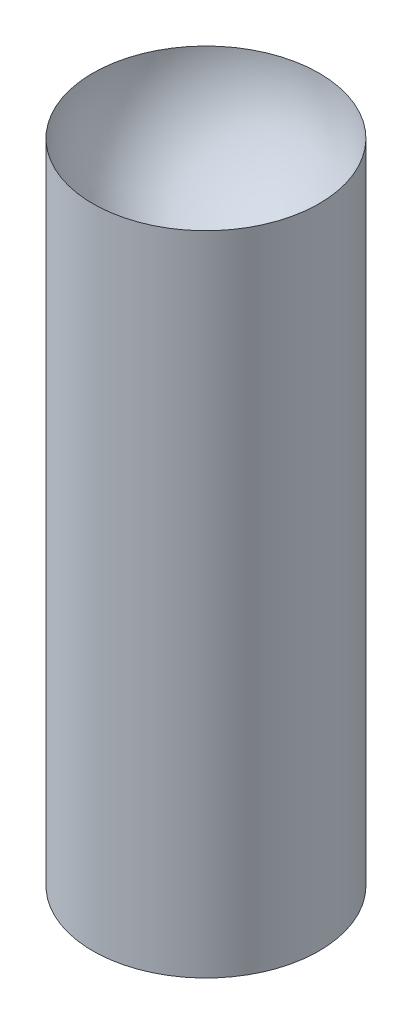
ISO-10303-21;
HEADER;
FILE_DESCRIPTION(('STEP AP214'),'2;1');
FILE_NAME('part.step','',(''),(''),'','','');
FILE_SCHEMA(('AUTOMOTIVE_DESIGN { 1 0 10303 214 1 1 1 1 }'));
ENDSEC;
DATA;
#1=APPLICATION_CONTEXT('core data for automotive mechanical design processes');
#2=APPLICATION_PROTOCOL_DEFINITION('international standard','automotive_design',2000,#1);
#3=PRODUCT_CONTEXT('',#1,'mechanical');
#4=PRODUCT('Part','Part','',(#3));
#5=PRODUCT_RELATED_PRODUCT_CATEGORY('part','',(#4));
#6=PRODUCT_DEFINITION_FORMATION('','',#4);
#7=PRODUCT_DEFINITION_CONTEXT('part definition',#1,'design');
#8=PRODUCT_DEFINITION('design','',#6,#7);
#9=PRODUCT_DEFINITION_SHAPE('','',#8);
#10=(LENGTH_UNIT() NAMED_UNIT(*) SI_UNIT(.MILLI.,.METRE.));
#11=(NAMED_UNIT(*) PLANE_ANGLE_UNIT() SI_UNIT($,.RADIAN.));
#12=(NAMED_UNIT(*) SI_UNIT($,.STERADIAN.) SOLID_ANGLE_UNIT());
#13=UNCERTAINTY_MEASURE_WITH_UNIT(LENGTH_MEASURE(1.E-05),#10,'distance_accuracy_value','');
#14=(GEOMETRIC_REPRESENTATION_CONTEXT(3) GLOBAL_UNCERTAINTY_ASSIGNED_CONTEXT((#13)) GLOBAL_UNIT_ASSIGNED_CONTEXT((#10,
#11,#12)) REPRESENTATION_CONTEXT('',''));
#15=CARTESIAN_POINT('',(0.,0.,0.));
#16=DIRECTION('',(0.,0.,1.));
#17=DIRECTION('',(1.,0.,0.));
#18=AXIS2_PLACEMENT_3D('',#15,#16,#17);
#19=CARTESIAN_POINT('',(0.,14.3,0.));
#20=DIRECTION('',(0.,-1.,0.));
#21=DIRECTION('',(0.,0.,-1.));
#22=AXIS2_PLACEMENT_3D('',#19,#20,#21);
#23=SPHERICAL_SURFACE('',#22,2.5);
#24=CARTESIAN_POINT('',(0.,14.3,0.));
#25=DIRECTION('',(0.,-1.,0.));
#26=DIRECTION('',(0.,0.,-1.));
#27=AXIS2_PLACEMENT_3D('',#24,#25,#26);
#28=CIRCLE('',#27,2.5);
#29=CARTESIAN_POINT('',(0.,14.3,-2.5));
#30=VERTEX_POINT('',#29);
#31=EDGE_CURVE('E10',#30,#30,#28,.T.);
#32=ORIENTED_EDGE('',*,*,#31,.F.);
#33=EDGE_LOOP('',(#32));
#34=FACE_BOUND('',#33,.T.);
#35=ADVANCED_FACE('F30',(#34),#23,.F.);
#36=CARTESIAN_POINT('',(0.,0.,0.));
#37=DIRECTION('',(0.,-1.,0.));
#38=DIRECTION('',(0.,0.,-1.));
#39=AXIS2_PLACEMENT_3D('',#36,#37,#38);
#40=CYLINDRICAL_SURFACE('',#39,2.5);
#41=ORIENTED_EDGE('',*,*,#31,.T.);
#42=EDGE_LOOP('',(#41));
#43=FACE_BOUND('',#42,.T.);
#44=CARTESIAN_POINT('',(0.,0.,0.));
#45=DIRECTION('',(0.,-1.,0.));
#46=DIRECTION('',(0.,0.,-1.));
#47=AXIS2_PLACEMENT_3D('',#44,#45,#46);
#48=CIRCLE('',#47,2.5);
#49=CARTESIAN_POINT('',(0.,0.,-2.5));
#50=VERTEX_POINT('',#49);
#51=EDGE_CURVE('E36',#50,#50,#48,.T.);
#52=ORIENTED_EDGE('',*,*,#51,.F.);
#53=EDGE_LOOP('',(#52));
#54=FACE_BOUND('',#53,.T.);
#55=ADVANCED_FACE('F44',(#43,#54),#40,.T.);
#56=CARTESIAN_POINT('',(0.,0.,0.));
#57=DIRECTION('',(0.,-1.,0.));
#58=DIRECTION('',(0.,0.,-1.));
#59=AXIS2_PLACEMENT_3D('',#56,#57,#58);
#60=PLANE('',#59);
#61=ORIENTED_EDGE('',*,*,#51,.T.);
#62=EDGE_LOOP('',(#61));
#63=FACE_BOUND('',#62,.T.);
#64=ADVANCED_FACE('F42',(#63),#60,.T.);
#65=CLOSED_SHELL('',(#35,#55,#64));
#66=MANIFOLD_SOLID_BREP('B2',#65);
#67=ADVANCED_BREP_SHAPE_REPRESENTATION('',(#18,#66),#14);
#68=SHAPE_DEFINITION_REPRESENTATION(#9,#67);
ENDSEC;
END-ISO-10303-21;
